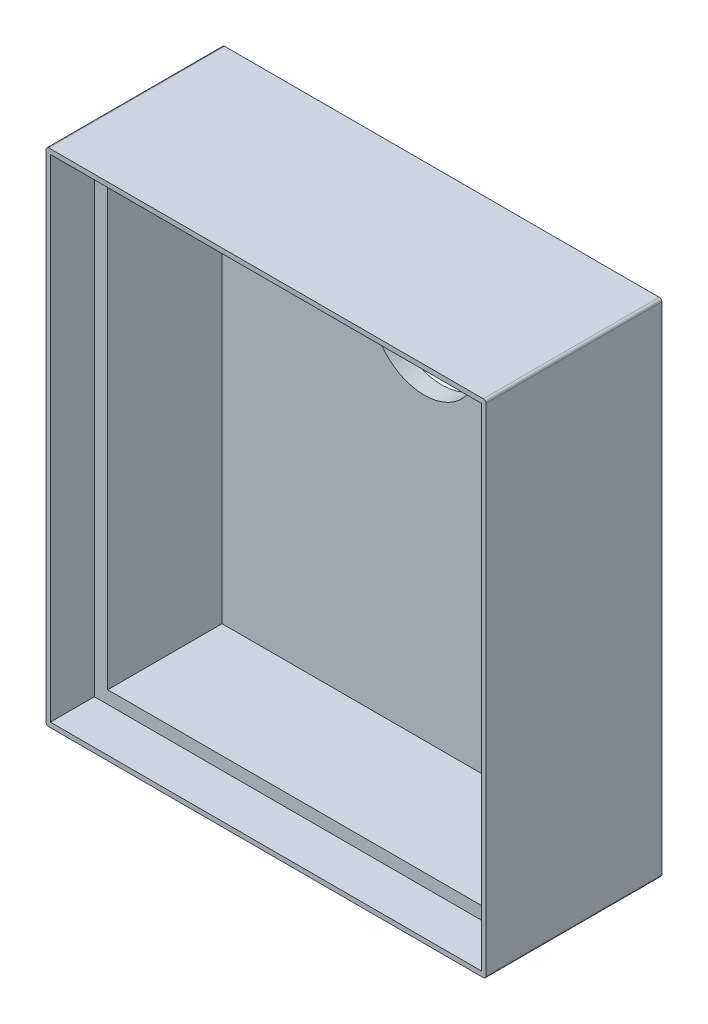
ISO-10303-21;
HEADER;
FILE_DESCRIPTION(('STEP AP214'),'2;1');
FILE_NAME('part.step','',(''),(''),'','','');
FILE_SCHEMA(('AUTOMOTIVE_DESIGN { 1 0 10303 214 1 1 1 1 }'));
ENDSEC;
DATA;
#1=APPLICATION_CONTEXT('core data for automotive mechanical design processes');
#2=APPLICATION_PROTOCOL_DEFINITION('international standard','automotive_design',2000,#1);
#3=PRODUCT_CONTEXT('',#1,'mechanical');
#4=PRODUCT('Part','Part','',(#3));
#5=PRODUCT_RELATED_PRODUCT_CATEGORY('part','',(#4));
#6=PRODUCT_DEFINITION_FORMATION('','',#4);
#7=PRODUCT_DEFINITION_CONTEXT('part definition',#1,'design');
#8=PRODUCT_DEFINITION('design','',#6,#7);
#9=PRODUCT_DEFINITION_SHAPE('','',#8);
#10=(LENGTH_UNIT() NAMED_UNIT(*) SI_UNIT(.MILLI.,.METRE.));
#11=(NAMED_UNIT(*) PLANE_ANGLE_UNIT() SI_UNIT($,.RADIAN.));
#12=(NAMED_UNIT(*) SI_UNIT($,.STERADIAN.) SOLID_ANGLE_UNIT());
#13=UNCERTAINTY_MEASURE_WITH_UNIT(LENGTH_MEASURE(1.E-05),#10,'distance_accuracy_value','');
#14=(GEOMETRIC_REPRESENTATION_CONTEXT(3) GLOBAL_UNCERTAINTY_ASSIGNED_CONTEXT((#13)) GLOBAL_UNIT_ASSIGNED_CONTEXT((#10,
#11,#12)) REPRESENTATION_CONTEXT('',''));
#15=CARTESIAN_POINT('',(0.,0.,0.));
#16=DIRECTION('',(0.,0.,1.));
#17=DIRECTION('',(1.,0.,0.));
#18=AXIS2_PLACEMENT_3D('',#15,#16,#17);
#19=CARTESIAN_POINT('',(497.,-567.,200.));
#20=DIRECTION('',(0.,0.,1.));
#21=DIRECTION('',(1.,0.,0.));
#22=AXIS2_PLACEMENT_3D('',#19,#20,#21);
#23=PLANE('',#22);
#24=CARTESIAN_POINT('',(497.,-567.,200.));
#25=DIRECTION('',(0.,0.,1.));
#26=DIRECTION('',(1.,0.,0.));
#27=AXIS2_PLACEMENT_3D('',#24,#25,#26);
#28=CIRCLE('',#27,3.);
#29=CARTESIAN_POINT('',(497.,-570.,200.));
#30=VERTEX_POINT('',#29);
#31=CARTESIAN_POINT('',(500.,-567.,200.));
#32=VERTEX_POINT('',#31);
#33=EDGE_CURVE('E213',#30,#32,#28,.T.);
#34=ORIENTED_EDGE('',*,*,#33,.T.);
#35=DIRECTION('',(0.,1.,0.));
#36=VECTOR('',#35,1.);
#37=CARTESIAN_POINT('',(500.,-3.00000000000002,200.));
#38=LINE('',#37,#36);
#39=CARTESIAN_POINT('',(500.,-3.00000000000002,200.));
#40=VERTEX_POINT('',#39);
#41=EDGE_CURVE('E216',#32,#40,#38,.T.);
#42=ORIENTED_EDGE('',*,*,#41,.T.);
#43=CARTESIAN_POINT('',(497.,-3.,200.));
#44=DIRECTION('',(0.,0.,1.));
#45=DIRECTION('',(-1.,0.,0.));
#46=AXIS2_PLACEMENT_3D('',#43,#44,#45);
#47=CIRCLE('',#46,3.);
#48=CARTESIAN_POINT('',(497.,0.,200.));
#49=VERTEX_POINT('',#48);
#50=EDGE_CURVE('E219',#40,#49,#47,.T.);
#51=ORIENTED_EDGE('',*,*,#50,.T.);
#52=DIRECTION('',(-1.,0.,0.));
#53=VECTOR('',#52,1.);
#54=CARTESIAN_POINT('',(3.00000000000002,0.,200.));
#55=LINE('',#54,#53);
#56=CARTESIAN_POINT('',(3.00000000000002,0.,200.));
#57=VERTEX_POINT('',#56);
#58=EDGE_CURVE('E221',#49,#57,#55,.T.);
#59=ORIENTED_EDGE('',*,*,#58,.T.);
#60=CARTESIAN_POINT('',(3.,-3.,200.));
#61=DIRECTION('',(0.,0.,1.));
#62=DIRECTION('',(-1.,0.,0.));
#63=AXIS2_PLACEMENT_3D('',#60,#61,#62);
#64=CIRCLE('',#63,3.);
#65=CARTESIAN_POINT('',(0.,-3.00000000000002,200.));
#66=VERTEX_POINT('',#65);
#67=EDGE_CURVE('E223',#57,#66,#64,.T.);
#68=ORIENTED_EDGE('',*,*,#67,.T.);
#69=DIRECTION('',(0.,-1.,0.));
#70=VECTOR('',#69,1.);
#71=CARTESIAN_POINT('',(0.,-3.00000000000002,200.));
#72=LINE('',#71,#70);
#73=CARTESIAN_POINT('',(0.,-567.,200.));
#74=VERTEX_POINT('',#73);
#75=EDGE_CURVE('E225',#66,#74,#72,.T.);
#76=ORIENTED_EDGE('',*,*,#75,.T.);
#77=CARTESIAN_POINT('',(3.00000000000007,-567.,200.));
#78=DIRECTION('',(0.,0.,1.));
#79=DIRECTION('',(-1.,0.,0.));
#80=AXIS2_PLACEMENT_3D('',#77,#78,#79);
#81=CIRCLE('',#80,3.);
#82=CARTESIAN_POINT('',(3.00000000000009,-570.,200.));
#83=VERTEX_POINT('',#82);
#84=EDGE_CURVE('E227',#74,#83,#81,.T.);
#85=ORIENTED_EDGE('',*,*,#84,.T.);
#86=DIRECTION('',(1.,0.,0.));
#87=VECTOR('',#86,1.);
#88=CARTESIAN_POINT('',(3.00000000000009,-570.,200.));
#89=LINE('',#88,#87);
#90=EDGE_CURVE('E229',#83,#30,#89,.T.);
#91=ORIENTED_EDGE('',*,*,#90,.T.);
#92=EDGE_LOOP('',(#34,#42,#51,#59,#68,#76,#85,#91));
#93=FACE_BOUND('',#92,.T.);
#94=DIRECTION('',(0.,-1.,0.));
#95=VECTOR('',#94,1.);
#96=CARTESIAN_POINT('',(4.78499999999998,0.,200.));
#97=LINE('',#96,#95);
#98=CARTESIAN_POINT('',(4.78499999999998,-5.48999999999999,200.));
#99=VERTEX_POINT('',#98);
#100=CARTESIAN_POINT('',(4.78499999999998,-564.51,200.));
#101=VERTEX_POINT('',#100);
#102=EDGE_CURVE('E173',#99,#101,#97,.T.);
#103=ORIENTED_EDGE('',*,*,#102,.F.);
#104=DIRECTION('',(1.,0.,0.));
#105=VECTOR('',#104,1.);
#106=CARTESIAN_POINT('',(0.,-5.48999999999994,200.));
#107=LINE('',#106,#105);
#108=CARTESIAN_POINT('',(495.215,-5.48999999999994,200.));
#109=VERTEX_POINT('',#108);
#110=EDGE_CURVE('E49',#99,#109,#107,.T.);
#111=ORIENTED_EDGE('',*,*,#110,.T.);
#112=DIRECTION('',(0.,1.,0.));
#113=VECTOR('',#112,1.);
#114=CARTESIAN_POINT('',(495.215,0.,200.));
#115=LINE('',#114,#113);
#116=CARTESIAN_POINT('',(495.215,-564.51,200.));
#117=VERTEX_POINT('',#116);
#118=EDGE_CURVE('E162',#117,#109,#115,.T.);
#119=ORIENTED_EDGE('',*,*,#118,.F.);
#120=DIRECTION('',(1.,0.,0.));
#121=VECTOR('',#120,1.);
#122=CARTESIAN_POINT('',(0.,-564.51,200.));
#123=LINE('',#122,#121);
#124=EDGE_CURVE('E175',#101,#117,#123,.T.);
#125=ORIENTED_EDGE('',*,*,#124,.F.);
#126=EDGE_LOOP('',(#103,#111,#119,#125));
#127=FACE_BOUND('',#126,.T.);
#128=ADVANCED_FACE('F33',(#93,#127),#23,.T.);
#129=CARTESIAN_POINT('',(497.,-567.,200.));
#130=DIRECTION('',(0.,0.,-1.));
#131=DIRECTION('',(-1.,0.,0.));
#132=AXIS2_PLACEMENT_3D('',#129,#130,#131);
#133=CYLINDRICAL_SURFACE('',#132,3.);
#134=CARTESIAN_POINT('',(497.,-567.,0.));
#135=DIRECTION('',(0.,0.,1.));
#136=DIRECTION('',(1.,0.,0.));
#137=AXIS2_PLACEMENT_3D('',#134,#135,#136);
#138=CIRCLE('',#137,3.);
#139=CARTESIAN_POINT('',(497.,-570.,0.));
#140=VERTEX_POINT('',#139);
#141=CARTESIAN_POINT('',(500.,-567.,0.));
#142=VERTEX_POINT('',#141);
#143=EDGE_CURVE('E201',#140,#142,#138,.T.);
#144=ORIENTED_EDGE('',*,*,#143,.T.);
#145=DIRECTION('',(0.,0.,-1.));
#146=VECTOR('',#145,1.);
#147=CARTESIAN_POINT('',(500.,-567.,200.));
#148=LINE('',#147,#146);
#149=EDGE_CURVE('E42',#32,#142,#148,.T.);
#150=ORIENTED_EDGE('',*,*,#149,.F.);
#151=ORIENTED_EDGE('',*,*,#33,.F.);
#152=DIRECTION('',(0.,0.,-1.));
#153=VECTOR('',#152,1.);
#154=CARTESIAN_POINT('',(497.,-570.,200.));
#155=LINE('',#154,#153);
#156=EDGE_CURVE('E231',#30,#140,#155,.T.);
#157=ORIENTED_EDGE('',*,*,#156,.T.);
#158=EDGE_LOOP('',(#144,#150,#151,#157));
#159=FACE_BOUND('',#158,.T.);
#160=ADVANCED_FACE('F35',(#159),#133,.T.);
#161=CARTESIAN_POINT('',(500.,-3.00000000000002,200.));
#162=DIRECTION('',(-1.,0.,0.));
#163=DIRECTION('',(0.,-1.,0.));
#164=AXIS2_PLACEMENT_3D('',#161,#162,#163);
#165=PLANE('',#164);
#166=DIRECTION('',(0.,1.,0.));
#167=VECTOR('',#166,1.);
#168=CARTESIAN_POINT('',(500.,-3.00000000000002,0.));
#169=LINE('',#168,#167);
#170=CARTESIAN_POINT('',(500.,-3.00000000000002,0.));
#171=VERTEX_POINT('',#170);
#172=EDGE_CURVE('E234',#142,#171,#169,.T.);
#173=ORIENTED_EDGE('',*,*,#172,.T.);
#174=DIRECTION('',(0.,0.,-1.));
#175=VECTOR('',#174,1.);
#176=CARTESIAN_POINT('',(500.,-3.00000000000002,200.));
#177=LINE('',#176,#175);
#178=EDGE_CURVE('E264',#40,#171,#177,.T.);
#179=ORIENTED_EDGE('',*,*,#178,.F.);
#180=ORIENTED_EDGE('',*,*,#41,.F.);
#181=ORIENTED_EDGE('',*,*,#149,.T.);
#182=EDGE_LOOP('',(#173,#179,#180,#181));
#183=FACE_BOUND('',#182,.T.);
#184=ADVANCED_FACE('F270',(#183),#165,.F.);
#185=CARTESIAN_POINT('',(497.,-3.,200.));
#186=DIRECTION('',(0.,0.,-1.));
#187=DIRECTION('',(-1.,0.,0.));
#188=AXIS2_PLACEMENT_3D('',#185,#186,#187);
#189=CYLINDRICAL_SURFACE('',#188,3.);
#190=CARTESIAN_POINT('',(497.,-3.,0.));
#191=DIRECTION('',(0.,0.,1.));
#192=DIRECTION('',(-1.,0.,0.));
#193=AXIS2_PLACEMENT_3D('',#190,#191,#192);
#194=CIRCLE('',#193,3.);
#195=CARTESIAN_POINT('',(497.,0.,0.));
#196=VERTEX_POINT('',#195);
#197=EDGE_CURVE('E236',#171,#196,#194,.T.);
#198=ORIENTED_EDGE('',*,*,#197,.T.);
#199=DIRECTION('',(0.,0.,-1.));
#200=VECTOR('',#199,1.);
#201=CARTESIAN_POINT('',(497.,0.,200.));
#202=LINE('',#201,#200);
#203=EDGE_CURVE('E261',#49,#196,#202,.T.);
#204=ORIENTED_EDGE('',*,*,#203,.F.);
#205=ORIENTED_EDGE('',*,*,#50,.F.);
#206=ORIENTED_EDGE('',*,*,#178,.T.);
#207=EDGE_LOOP('',(#198,#204,#205,#206));
#208=FACE_BOUND('',#207,.T.);
#209=ADVANCED_FACE('F285',(#208),#189,.T.);
#210=CARTESIAN_POINT('',(3.00000000000002,0.,200.));
#211=DIRECTION('',(0.,-1.,0.));
#212=DIRECTION('',(0.,0.,-1.));
#213=AXIS2_PLACEMENT_3D('',#210,#211,#212);
#214=PLANE('',#213);
#215=DIRECTION('',(-1.,0.,0.));
#216=VECTOR('',#215,1.);
#217=CARTESIAN_POINT('',(3.00000000000002,0.,0.));
#218=LINE('',#217,#216);
#219=CARTESIAN_POINT('',(3.00000000000002,0.,0.));
#220=VERTEX_POINT('',#219);
#221=EDGE_CURVE('E238',#196,#220,#218,.T.);
#222=ORIENTED_EDGE('',*,*,#221,.T.);
#223=DIRECTION('',(0.,0.,-1.));
#224=VECTOR('',#223,1.);
#225=CARTESIAN_POINT('',(3.00000000000002,0.,200.));
#226=LINE('',#225,#224);
#227=EDGE_CURVE('E258',#57,#220,#226,.T.);
#228=ORIENTED_EDGE('',*,*,#227,.F.);
#229=ORIENTED_EDGE('',*,*,#58,.F.);
#230=ORIENTED_EDGE('',*,*,#203,.T.);
#231=EDGE_LOOP('',(#222,#228,#229,#230));
#232=FACE_BOUND('',#231,.T.);
#233=ADVANCED_FACE('F289',(#232),#214,.F.);
#234=CARTESIAN_POINT('',(3.,-3.,200.));
#235=DIRECTION('',(0.,0.,-1.));
#236=DIRECTION('',(-1.,0.,0.));
#237=AXIS2_PLACEMENT_3D('',#234,#235,#236);
#238=CYLINDRICAL_SURFACE('',#237,3.);
#239=CARTESIAN_POINT('',(3.,-3.,0.));
#240=DIRECTION('',(0.,0.,1.));
#241=DIRECTION('',(-1.,0.,0.));
#242=AXIS2_PLACEMENT_3D('',#239,#240,#241);
#243=CIRCLE('',#242,3.);
#244=CARTESIAN_POINT('',(0.,-3.00000000000002,0.));
#245=VERTEX_POINT('',#244);
#246=EDGE_CURVE('E240',#220,#245,#243,.T.);
#247=ORIENTED_EDGE('',*,*,#246,.T.);
#248=DIRECTION('',(0.,0.,-1.));
#249=VECTOR('',#248,1.);
#250=CARTESIAN_POINT('',(0.,-3.00000000000002,200.));
#251=LINE('',#250,#249);
#252=EDGE_CURVE('E255',#66,#245,#251,.T.);
#253=ORIENTED_EDGE('',*,*,#252,.F.);
#254=ORIENTED_EDGE('',*,*,#67,.F.);
#255=ORIENTED_EDGE('',*,*,#227,.T.);
#256=EDGE_LOOP('',(#247,#253,#254,#255));
#257=FACE_BOUND('',#256,.T.);
#258=ADVANCED_FACE('F308',(#257),#238,.T.);
#259=CARTESIAN_POINT('',(0.,-3.00000000000002,200.));
#260=DIRECTION('',(1.,0.,0.));
#261=DIRECTION('',(0.,1.,0.));
#262=AXIS2_PLACEMENT_3D('',#259,#260,#261);
#263=PLANE('',#262);
#264=DIRECTION('',(0.,-1.,0.));
#265=VECTOR('',#264,1.);
#266=CARTESIAN_POINT('',(0.,-3.00000000000002,0.));
#267=LINE('',#266,#265);
#268=CARTESIAN_POINT('',(0.,-567.,0.));
#269=VERTEX_POINT('',#268);
#270=EDGE_CURVE('E242',#245,#269,#267,.T.);
#271=ORIENTED_EDGE('',*,*,#270,.T.);
#272=DIRECTION('',(0.,0.,-1.));
#273=VECTOR('',#272,1.);
#274=CARTESIAN_POINT('',(0.,-567.,200.));
#275=LINE('',#274,#273);
#276=EDGE_CURVE('E252',#74,#269,#275,.T.);
#277=ORIENTED_EDGE('',*,*,#276,.F.);
#278=ORIENTED_EDGE('',*,*,#75,.F.);
#279=ORIENTED_EDGE('',*,*,#252,.T.);
#280=EDGE_LOOP('',(#271,#277,#278,#279));
#281=FACE_BOUND('',#280,.T.);
#282=ADVANCED_FACE('F305',(#281),#263,.F.);
#283=CARTESIAN_POINT('',(3.00000000000007,-567.,200.));
#284=DIRECTION('',(0.,0.,-1.));
#285=DIRECTION('',(-1.,0.,0.));
#286=AXIS2_PLACEMENT_3D('',#283,#284,#285);
#287=CYLINDRICAL_SURFACE('',#286,3.);
#288=CARTESIAN_POINT('',(3.00000000000007,-567.,0.));
#289=DIRECTION('',(0.,0.,1.));
#290=DIRECTION('',(-1.,0.,0.));
#291=AXIS2_PLACEMENT_3D('',#288,#289,#290);
#292=CIRCLE('',#291,3.);
#293=CARTESIAN_POINT('',(3.00000000000009,-570.,0.));
#294=VERTEX_POINT('',#293);
#295=EDGE_CURVE('E244',#269,#294,#292,.T.);
#296=ORIENTED_EDGE('',*,*,#295,.T.);
#297=DIRECTION('',(0.,0.,-1.));
#298=VECTOR('',#297,1.);
#299=CARTESIAN_POINT('',(3.00000000000009,-570.,200.));
#300=LINE('',#299,#298);
#301=EDGE_CURVE('E249',#83,#294,#300,.T.);
#302=ORIENTED_EDGE('',*,*,#301,.F.);
#303=ORIENTED_EDGE('',*,*,#84,.F.);
#304=ORIENTED_EDGE('',*,*,#276,.T.);
#305=EDGE_LOOP('',(#296,#302,#303,#304));
#306=FACE_BOUND('',#305,.T.);
#307=ADVANCED_FACE('F301',(#306),#287,.T.);
#308=CARTESIAN_POINT('',(3.00000000000009,-570.,200.));
#309=DIRECTION('',(0.,1.,0.));
#310=DIRECTION('',(0.,0.,1.));
#311=AXIS2_PLACEMENT_3D('',#308,#309,#310);
#312=PLANE('',#311);
#313=DIRECTION('',(1.,0.,0.));
#314=VECTOR('',#313,1.);
#315=CARTESIAN_POINT('',(3.00000000000009,-570.,0.));
#316=LINE('',#315,#314);
#317=EDGE_CURVE('E217',#294,#140,#316,.T.);
#318=ORIENTED_EDGE('',*,*,#317,.T.);
#319=ORIENTED_EDGE('',*,*,#156,.F.);
#320=ORIENTED_EDGE('',*,*,#90,.F.);
#321=ORIENTED_EDGE('',*,*,#301,.T.);
#322=EDGE_LOOP('',(#318,#319,#320,#321));
#323=FACE_BOUND('',#322,.T.);
#324=ADVANCED_FACE('F299',(#323),#312,.F.);
#325=CARTESIAN_POINT('',(497.,-567.,0.));
#326=DIRECTION('',(0.,0.,1.));
#327=DIRECTION('',(1.,0.,0.));
#328=AXIS2_PLACEMENT_3D('',#325,#326,#327);
#329=PLANE('',#328);
#330=CARTESIAN_POINT('',(250.,-150.,0.));
#331=DIRECTION('',(0.,0.,-1.));
#332=DIRECTION('',(-1.,0.,0.));
#333=AXIS2_PLACEMENT_3D('',#330,#331,#332);
#334=CIRCLE('',#333,60.);
#335=CARTESIAN_POINT('',(190.,-150.,0.));
#336=VERTEX_POINT('',#335);
#337=EDGE_CURVE('E509',#336,#336,#334,.T.);
#338=ORIENTED_EDGE('',*,*,#337,.F.);
#339=EDGE_LOOP('',(#338));
#340=FACE_BOUND('',#339,.T.);
#341=ORIENTED_EDGE('',*,*,#143,.F.);
#342=ORIENTED_EDGE('',*,*,#317,.F.);
#343=ORIENTED_EDGE('',*,*,#295,.F.);
#344=ORIENTED_EDGE('',*,*,#270,.F.);
#345=ORIENTED_EDGE('',*,*,#246,.F.);
#346=ORIENTED_EDGE('',*,*,#221,.F.);
#347=ORIENTED_EDGE('',*,*,#197,.F.);
#348=ORIENTED_EDGE('',*,*,#172,.F.);
#349=EDGE_LOOP('',(#341,#342,#343,#344,#345,#346,#347,#348));
#350=FACE_BOUND('',#349,.T.);
#351=ADVANCED_FACE('F278',(#340,#350),#329,.F.);
#352=CARTESIAN_POINT('',(0.,-5.48999999999994,150.));
#353=DIRECTION('',(0.,-1.,0.));
#354=DIRECTION('',(0.,0.,-1.));
#355=AXIS2_PLACEMENT_3D('',#352,#353,#354);
#356=PLANE('',#355);
#357=ORIENTED_EDGE('',*,*,#110,.F.);
#358=DIRECTION('',(0.,0.,1.));
#359=VECTOR('',#358,1.);
#360=CARTESIAN_POINT('',(4.78499999999998,-5.48999999999994,150.));
#361=LINE('',#360,#359);
#362=CARTESIAN_POINT('',(4.78499999999998,-5.48999999999994,150.));
#363=VERTEX_POINT('',#362);
#364=EDGE_CURVE('E143',#363,#99,#361,.T.);
#365=ORIENTED_EDGE('',*,*,#364,.F.);
#366=DIRECTION('',(1.,0.,0.));
#367=VECTOR('',#366,1.);
#368=CARTESIAN_POINT('',(0.,-5.48999999999994,150.));
#369=LINE('',#368,#367);
#370=CARTESIAN_POINT('',(495.215,-5.48999999999994,150.));
#371=VERTEX_POINT('',#370);
#372=EDGE_CURVE('E146',#363,#371,#369,.T.);
#373=ORIENTED_EDGE('',*,*,#372,.T.);
#374=DIRECTION('',(0.,0.,1.));
#375=VECTOR('',#374,1.);
#376=CARTESIAN_POINT('',(495.215,-5.48999999999994,150.));
#377=LINE('',#376,#375);
#378=EDGE_CURVE('E180',#371,#109,#377,.T.);
#379=ORIENTED_EDGE('',*,*,#378,.T.);
#380=EDGE_LOOP('',(#357,#365,#373,#379));
#381=FACE_BOUND('',#380,.T.);
#382=ADVANCED_FACE('F145',(#381),#356,.T.);
#383=CARTESIAN_POINT('',(495.215,0.,150.));
#384=DIRECTION('',(1.,0.,0.));
#385=DIRECTION('',(0.,0.,-1.));
#386=AXIS2_PLACEMENT_3D('',#383,#384,#385);
#387=PLANE('',#386);
#388=ORIENTED_EDGE('',*,*,#118,.T.);
#389=ORIENTED_EDGE('',*,*,#378,.F.);
#390=DIRECTION('',(0.,1.,0.));
#391=VECTOR('',#390,1.);
#392=CARTESIAN_POINT('',(495.215,0.,150.));
#393=LINE('',#392,#391);
#394=CARTESIAN_POINT('',(495.215,-564.51,150.));
#395=VERTEX_POINT('',#394);
#396=EDGE_CURVE('E153',#395,#371,#393,.T.);
#397=ORIENTED_EDGE('',*,*,#396,.F.);
#398=DIRECTION('',(0.,0.,1.));
#399=VECTOR('',#398,1.);
#400=CARTESIAN_POINT('',(495.215,-564.51,150.));
#401=LINE('',#400,#399);
#402=EDGE_CURVE('E183',#395,#117,#401,.T.);
#403=ORIENTED_EDGE('',*,*,#402,.T.);
#404=EDGE_LOOP('',(#388,#389,#397,#403));
#405=FACE_BOUND('',#404,.T.);
#406=ADVANCED_FACE('F352',(#405),#387,.F.);
#407=CARTESIAN_POINT('',(0.,-564.51,150.));
#408=DIRECTION('',(0.,-1.,0.));
#409=DIRECTION('',(0.,0.,-1.));
#410=AXIS2_PLACEMENT_3D('',#407,#408,#409);
#411=PLANE('',#410);
#412=ORIENTED_EDGE('',*,*,#124,.T.);
#413=ORIENTED_EDGE('',*,*,#402,.F.);
#414=DIRECTION('',(1.,0.,0.));
#415=VECTOR('',#414,1.);
#416=CARTESIAN_POINT('',(0.,-564.51,150.));
#417=LINE('',#416,#415);
#418=CARTESIAN_POINT('',(4.78499999999998,-564.51,150.));
#419=VERTEX_POINT('',#418);
#420=EDGE_CURVE('E166',#419,#395,#417,.T.);
#421=ORIENTED_EDGE('',*,*,#420,.F.);
#422=DIRECTION('',(0.,0.,1.));
#423=VECTOR('',#422,1.);
#424=CARTESIAN_POINT('',(4.78499999999998,-564.51,150.));
#425=LINE('',#424,#423);
#426=EDGE_CURVE('E152',#419,#101,#425,.T.);
#427=ORIENTED_EDGE('',*,*,#426,.T.);
#428=EDGE_LOOP('',(#412,#413,#421,#427));
#429=FACE_BOUND('',#428,.T.);
#430=ADVANCED_FACE('F359',(#429),#411,.F.);
#431=CARTESIAN_POINT('',(4.78499999999998,0.,150.));
#432=DIRECTION('',(-1.,0.,0.));
#433=DIRECTION('',(0.,0.,1.));
#434=AXIS2_PLACEMENT_3D('',#431,#432,#433);
#435=PLANE('',#434);
#436=ORIENTED_EDGE('',*,*,#102,.T.);
#437=ORIENTED_EDGE('',*,*,#426,.F.);
#438=DIRECTION('',(0.,-1.,0.));
#439=VECTOR('',#438,1.);
#440=CARTESIAN_POINT('',(4.78499999999998,0.,150.));
#441=LINE('',#440,#439);
#442=EDGE_CURVE('E160',#363,#419,#441,.T.);
#443=ORIENTED_EDGE('',*,*,#442,.F.);
#444=ORIENTED_EDGE('',*,*,#364,.T.);
#445=EDGE_LOOP('',(#436,#437,#443,#444));
#446=FACE_BOUND('',#445,.T.);
#447=ADVANCED_FACE('F164',(#446),#435,.F.);
#448=CARTESIAN_POINT('',(0.,0.,150.));
#449=DIRECTION('',(0.,0.,1.));
#450=DIRECTION('',(1.,0.,0.));
#451=AXIS2_PLACEMENT_3D('',#448,#449,#450);
#452=PLANE('',#451);
#453=DIRECTION('',(1.,0.,0.));
#454=VECTOR('',#453,1.);
#455=CARTESIAN_POINT('',(3.00000000000009,-550.,150.));
#456=LINE('',#455,#454);
#457=CARTESIAN_POINT('',(20.0000000000001,-550.,150.));
#458=VERTEX_POINT('',#457);
#459=CARTESIAN_POINT('',(480.,-550.,150.));
#460=VERTEX_POINT('',#459);
#461=EDGE_CURVE('E11',#458,#460,#456,.T.);
#462=ORIENTED_EDGE('',*,*,#461,.F.);
#463=DIRECTION('',(0.,-1.,0.));
#464=VECTOR('',#463,1.);
#465=CARTESIAN_POINT('',(20.,-3.00000000000002,150.));
#466=LINE('',#465,#464);
#467=CARTESIAN_POINT('',(20.,-20.,150.));
#468=VERTEX_POINT('',#467);
#469=EDGE_CURVE('E182',#468,#458,#466,.T.);
#470=ORIENTED_EDGE('',*,*,#469,.F.);
#471=DIRECTION('',(-1.,0.,0.));
#472=VECTOR('',#471,1.);
#473=CARTESIAN_POINT('',(3.00000000000002,-20.,150.));
#474=LINE('',#473,#472);
#475=CARTESIAN_POINT('',(480.,-20.,150.));
#476=VERTEX_POINT('',#475);
#477=EDGE_CURVE('E188',#476,#468,#474,.T.);
#478=ORIENTED_EDGE('',*,*,#477,.F.);
#479=DIRECTION('',(0.,1.,0.));
#480=VECTOR('',#479,1.);
#481=CARTESIAN_POINT('',(480.,-3.00000000000002,150.));
#482=LINE('',#481,#480);
#483=EDGE_CURVE('E57',#460,#476,#482,.T.);
#484=ORIENTED_EDGE('',*,*,#483,.F.);
#485=EDGE_LOOP('',(#462,#470,#478,#484));
#486=FACE_BOUND('',#485,.T.);
#487=ORIENTED_EDGE('',*,*,#372,.F.);
#488=ORIENTED_EDGE('',*,*,#442,.T.);
#489=ORIENTED_EDGE('',*,*,#420,.T.);
#490=ORIENTED_EDGE('',*,*,#396,.T.);
#491=EDGE_LOOP('',(#487,#488,#489,#490));
#492=FACE_BOUND('',#491,.T.);
#493=ADVANCED_FACE('F158',(#486,#492),#452,.T.);
#494=CARTESIAN_POINT('',(497.,-567.,20.));
#495=DIRECTION('',(0.,0.,1.));
#496=DIRECTION('',(1.,0.,0.));
#497=AXIS2_PLACEMENT_3D('',#494,#495,#496);
#498=PLANE('',#497);
#499=CARTESIAN_POINT('',(250.,-150.,20.));
#500=DIRECTION('',(0.,0.,1.));
#501=DIRECTION('',(1.,0.,0.));
#502=AXIS2_PLACEMENT_3D('',#499,#500,#501);
#503=CIRCLE('',#502,60.);
#504=CARTESIAN_POINT('',(310.,-150.,20.));
#505=VERTEX_POINT('',#504);
#506=EDGE_CURVE('E37',#505,#505,#503,.T.);
#507=ORIENTED_EDGE('',*,*,#506,.F.);
#508=EDGE_LOOP('',(#507));
#509=FACE_BOUND('',#508,.T.);
#510=DIRECTION('',(0.,1.,0.));
#511=VECTOR('',#510,1.);
#512=CARTESIAN_POINT('',(480.,-3.00000000000002,20.));
#513=LINE('',#512,#511);
#514=CARTESIAN_POINT('',(480.,-550.,20.));
#515=VERTEX_POINT('',#514);
#516=CARTESIAN_POINT('',(480.,-20.,20.));
#517=VERTEX_POINT('',#516);
#518=EDGE_CURVE('E192',#515,#517,#513,.T.);
#519=ORIENTED_EDGE('',*,*,#518,.T.);
#520=DIRECTION('',(-1.,0.,0.));
#521=VECTOR('',#520,1.);
#522=CARTESIAN_POINT('',(3.00000000000002,-20.,20.));
#523=LINE('',#522,#521);
#524=CARTESIAN_POINT('',(20.,-20.,20.));
#525=VERTEX_POINT('',#524);
#526=EDGE_CURVE('E195',#517,#525,#523,.T.);
#527=ORIENTED_EDGE('',*,*,#526,.T.);
#528=DIRECTION('',(0.,-1.,0.));
#529=VECTOR('',#528,1.);
#530=CARTESIAN_POINT('',(20.,-3.00000000000002,20.));
#531=LINE('',#530,#529);
#532=CARTESIAN_POINT('',(20.0000000000001,-550.,20.));
#533=VERTEX_POINT('',#532);
#534=EDGE_CURVE('E204',#525,#533,#531,.T.);
#535=ORIENTED_EDGE('',*,*,#534,.T.);
#536=DIRECTION('',(1.,0.,0.));
#537=VECTOR('',#536,1.);
#538=CARTESIAN_POINT('',(3.00000000000009,-550.,20.));
#539=LINE('',#538,#537);
#540=EDGE_CURVE('E209',#533,#515,#539,.T.);
#541=ORIENTED_EDGE('',*,*,#540,.T.);
#542=EDGE_LOOP('',(#519,#527,#535,#541));
#543=FACE_BOUND('',#542,.T.);
#544=ADVANCED_FACE('F324',(#509,#543),#498,.T.);
#545=CARTESIAN_POINT('',(3.00000000000009,-550.,200.));
#546=DIRECTION('',(0.,1.,0.));
#547=DIRECTION('',(0.,0.,1.));
#548=AXIS2_PLACEMENT_3D('',#545,#546,#547);
#549=PLANE('',#548);
#550=DIRECTION('',(0.,0.,-1.));
#551=VECTOR('',#550,1.);
#552=CARTESIAN_POINT('',(20.0000000000001,-550.,200.));
#553=LINE('',#552,#551);
#554=EDGE_CURVE('E206',#458,#533,#553,.T.);
#555=ORIENTED_EDGE('',*,*,#554,.F.);
#556=ORIENTED_EDGE('',*,*,#461,.T.);
#557=DIRECTION('',(0.,0.,-1.));
#558=VECTOR('',#557,1.);
#559=CARTESIAN_POINT('',(480.,-550.,200.));
#560=LINE('',#559,#558);
#561=EDGE_CURVE('E198',#460,#515,#560,.T.);
#562=ORIENTED_EDGE('',*,*,#561,.T.);
#563=ORIENTED_EDGE('',*,*,#540,.F.);
#564=EDGE_LOOP('',(#555,#556,#562,#563));
#565=FACE_BOUND('',#564,.T.);
#566=ADVANCED_FACE('F386',(#565),#549,.T.);
#567=CARTESIAN_POINT('',(20.,-3.00000000000002,200.));
#568=DIRECTION('',(1.,0.,0.));
#569=DIRECTION('',(0.,1.,0.));
#570=AXIS2_PLACEMENT_3D('',#567,#568,#569);
#571=PLANE('',#570);
#572=DIRECTION('',(0.,0.,-1.));
#573=VECTOR('',#572,1.);
#574=CARTESIAN_POINT('',(20.,-20.,200.));
#575=LINE('',#574,#573);
#576=EDGE_CURVE('E199',#468,#525,#575,.T.);
#577=ORIENTED_EDGE('',*,*,#576,.F.);
#578=ORIENTED_EDGE('',*,*,#469,.T.);
#579=ORIENTED_EDGE('',*,*,#554,.T.);
#580=ORIENTED_EDGE('',*,*,#534,.F.);
#581=EDGE_LOOP('',(#577,#578,#579,#580));
#582=FACE_BOUND('',#581,.T.);
#583=ADVANCED_FACE('F393',(#582),#571,.T.);
#584=CARTESIAN_POINT('',(3.00000000000002,-20.,200.));
#585=DIRECTION('',(0.,-1.,0.));
#586=DIRECTION('',(0.,0.,-1.));
#587=AXIS2_PLACEMENT_3D('',#584,#585,#586);
#588=PLANE('',#587);
#589=DIRECTION('',(0.,0.,-1.));
#590=VECTOR('',#589,1.);
#591=CARTESIAN_POINT('',(480.,-20.,200.));
#592=LINE('',#591,#590);
#593=EDGE_CURVE('E196',#476,#517,#592,.T.);
#594=ORIENTED_EDGE('',*,*,#593,.F.);
#595=ORIENTED_EDGE('',*,*,#477,.T.);
#596=ORIENTED_EDGE('',*,*,#576,.T.);
#597=ORIENTED_EDGE('',*,*,#526,.F.);
#598=EDGE_LOOP('',(#594,#595,#596,#597));
#599=FACE_BOUND('',#598,.T.);
#600=ADVANCED_FACE('F400',(#599),#588,.T.);
#601=CARTESIAN_POINT('',(480.,-3.00000000000002,200.));
#602=DIRECTION('',(-1.,0.,0.));
#603=DIRECTION('',(0.,-1.,0.));
#604=AXIS2_PLACEMENT_3D('',#601,#602,#603);
#605=PLANE('',#604);
#606=ORIENTED_EDGE('',*,*,#561,.F.);
#607=ORIENTED_EDGE('',*,*,#483,.T.);
#608=ORIENTED_EDGE('',*,*,#593,.T.);
#609=ORIENTED_EDGE('',*,*,#518,.F.);
#610=EDGE_LOOP('',(#606,#607,#608,#609));
#611=FACE_BOUND('',#610,.T.);
#612=ADVANCED_FACE('F408',(#611),#605,.T.);
#613=CARTESIAN_POINT('',(250.,-150.,50.));
#614=DIRECTION('',(0.,0.,-1.));
#615=DIRECTION('',(-1.,0.,0.));
#616=AXIS2_PLACEMENT_3D('',#613,#614,#615);
#617=CYLINDRICAL_SURFACE('',#616,60.);
#618=ORIENTED_EDGE('',*,*,#506,.T.);
#619=EDGE_LOOP('',(#618));
#620=FACE_BOUND('',#619,.T.);
#621=ORIENTED_EDGE('',*,*,#337,.T.);
#622=EDGE_LOOP('',(#621));
#623=FACE_BOUND('',#622,.T.);
#624=ADVANCED_FACE('F415',(#620,#623),#617,.F.);
#625=CLOSED_SHELL('',(#128,#160,#184,#209,#233,#258,#282,#307,#324,#351,#382,#406,#430,#447,
#493,#544,#566,#583,#600,#612,#624));
#626=MANIFOLD_SOLID_BREP('B2',#625);
#627=ADVANCED_BREP_SHAPE_REPRESENTATION('',(#18,#626),#14);
#628=SHAPE_DEFINITION_REPRESENTATION(#9,#627);
ENDSEC;
END-ISO-10303-21;
